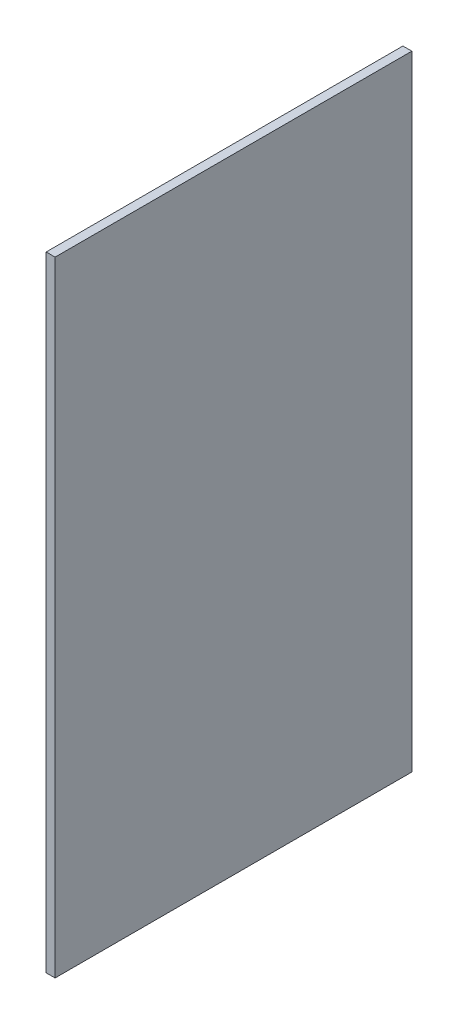
ISO-10303-21;
HEADER;
FILE_DESCRIPTION(('STEP AP214'),'2;1');
FILE_NAME('part.step','',(''),(''),'','','');
FILE_SCHEMA(('AUTOMOTIVE_DESIGN { 1 0 10303 214 1 1 1 1 }'));
ENDSEC;
DATA;
#1=APPLICATION_CONTEXT('core data for automotive mechanical design processes');
#2=APPLICATION_PROTOCOL_DEFINITION('international standard','automotive_design',2000,#1);
#3=PRODUCT_CONTEXT('',#1,'mechanical');
#4=PRODUCT('Part','Part','',(#3));
#5=PRODUCT_RELATED_PRODUCT_CATEGORY('part','',(#4));
#6=PRODUCT_DEFINITION_FORMATION('','',#4);
#7=PRODUCT_DEFINITION_CONTEXT('part definition',#1,'design');
#8=PRODUCT_DEFINITION('design','',#6,#7);
#9=PRODUCT_DEFINITION_SHAPE('','',#8);
#10=(LENGTH_UNIT() NAMED_UNIT(*) SI_UNIT(.MILLI.,.METRE.));
#11=(NAMED_UNIT(*) PLANE_ANGLE_UNIT() SI_UNIT($,.RADIAN.));
#12=(NAMED_UNIT(*) SI_UNIT($,.STERADIAN.) SOLID_ANGLE_UNIT());
#13=UNCERTAINTY_MEASURE_WITH_UNIT(LENGTH_MEASURE(1.E-05),#10,'distance_accuracy_value','');
#14=(GEOMETRIC_REPRESENTATION_CONTEXT(3) GLOBAL_UNCERTAINTY_ASSIGNED_CONTEXT((#13)) GLOBAL_UNIT_ASSIGNED_CONTEXT((#10,
#11,#12)) REPRESENTATION_CONTEXT('',''));
#15=CARTESIAN_POINT('',(0.,0.,0.));
#16=DIRECTION('',(0.,0.,1.));
#17=DIRECTION('',(1.,0.,0.));
#18=AXIS2_PLACEMENT_3D('',#15,#16,#17);
#19=CARTESIAN_POINT('',(1.,-32.1705539085013,36.6871117788508));
#20=DIRECTION('',(0.,0.,1.));
#21=DIRECTION('',(1.,0.,0.));
#22=AXIS2_PLACEMENT_3D('',#19,#20,#21);
#23=PLANE('',#22);
#24=DIRECTION('',(0.,1.,0.));
#25=VECTOR('',#24,1.);
#26=CARTESIAN_POINT('',(0.,-32.1705539085013,36.6871117788508));
#27=LINE('',#26,#25);
#28=CARTESIAN_POINT('',(0.,-32.1705539085013,36.6871117788508));
#29=VERTEX_POINT('',#28);
#30=CARTESIAN_POINT('',(0.,37.8294460914987,36.6871117788508));
#31=VERTEX_POINT('',#30);
#32=EDGE_CURVE('E100',#29,#31,#27,.T.);
#33=ORIENTED_EDGE('',*,*,#32,.T.);
#34=DIRECTION('',(-1.,0.,0.));
#35=VECTOR('',#34,1.);
#36=CARTESIAN_POINT('',(1.,37.8294460914987,36.6871117788508));
#37=LINE('',#36,#35);
#38=CARTESIAN_POINT('',(1.,37.8294460914987,36.6871117788508));
#39=VERTEX_POINT('',#38);
#40=EDGE_CURVE('E11',#39,#31,#37,.T.);
#41=ORIENTED_EDGE('',*,*,#40,.F.);
#42=DIRECTION('',(0.,1.,0.));
#43=VECTOR('',#42,1.);
#44=CARTESIAN_POINT('',(1.,-32.1705539085013,36.6871117788508));
#45=LINE('',#44,#43);
#46=CARTESIAN_POINT('',(1.,-32.1705539085013,36.6871117788508));
#47=VERTEX_POINT('',#46);
#48=EDGE_CURVE('E88',#47,#39,#45,.T.);
#49=ORIENTED_EDGE('',*,*,#48,.F.);
#50=DIRECTION('',(-1.,0.,0.));
#51=VECTOR('',#50,1.);
#52=CARTESIAN_POINT('',(1.,-32.1705539085013,36.6871117788508));
#53=LINE('',#52,#51);
#54=EDGE_CURVE('E96',#47,#29,#53,.T.);
#55=ORIENTED_EDGE('',*,*,#54,.T.);
#56=EDGE_LOOP('',(#33,#41,#49,#55));
#57=FACE_BOUND('',#56,.T.);
#58=ADVANCED_FACE('F37',(#57),#23,.F.);
#59=CARTESIAN_POINT('',(1.,37.8294460914987,36.6871117788508));
#60=DIRECTION('',(0.,-1.,0.));
#61=DIRECTION('',(0.,0.,-1.));
#62=AXIS2_PLACEMENT_3D('',#59,#60,#61);
#63=PLANE('',#62);
#64=DIRECTION('',(0.,0.,1.));
#65=VECTOR('',#64,1.);
#66=CARTESIAN_POINT('',(0.,37.8294460914987,36.6871117788508));
#67=LINE('',#66,#65);
#68=CARTESIAN_POINT('',(0.,37.8294460914987,76.6871117788508));
#69=VERTEX_POINT('',#68);
#70=EDGE_CURVE('E92',#31,#69,#67,.T.);
#71=ORIENTED_EDGE('',*,*,#70,.T.);
#72=DIRECTION('',(-1.,0.,0.));
#73=VECTOR('',#72,1.);
#74=CARTESIAN_POINT('',(1.,37.8294460914987,76.6871117788508));
#75=LINE('',#74,#73);
#76=CARTESIAN_POINT('',(1.,37.8294460914987,76.6871117788508));
#77=VERTEX_POINT('',#76);
#78=EDGE_CURVE('E45',#77,#69,#75,.T.);
#79=ORIENTED_EDGE('',*,*,#78,.F.);
#80=DIRECTION('',(0.,0.,1.));
#81=VECTOR('',#80,1.);
#82=CARTESIAN_POINT('',(1.,37.8294460914987,36.6871117788508));
#83=LINE('',#82,#81);
#84=EDGE_CURVE('E83',#39,#77,#83,.T.);
#85=ORIENTED_EDGE('',*,*,#84,.F.);
#86=ORIENTED_EDGE('',*,*,#40,.T.);
#87=EDGE_LOOP('',(#71,#79,#85,#86));
#88=FACE_BOUND('',#87,.T.);
#89=ADVANCED_FACE('F91',(#88),#63,.F.);
#90=CARTESIAN_POINT('',(1.,-32.1705539085013,76.6871117788508));
#91=DIRECTION('',(0.,0.,-1.));
#92=DIRECTION('',(-1.,0.,0.));
#93=AXIS2_PLACEMENT_3D('',#90,#91,#92);
#94=PLANE('',#93);
#95=DIRECTION('',(0.,-1.,0.));
#96=VECTOR('',#95,1.);
#97=CARTESIAN_POINT('',(0.,-32.1705539085013,76.6871117788508));
#98=LINE('',#97,#96);
#99=CARTESIAN_POINT('',(0.,-32.1705539085013,76.6871117788508));
#100=VERTEX_POINT('',#99);
#101=EDGE_CURVE('E70',#69,#100,#98,.T.);
#102=ORIENTED_EDGE('',*,*,#101,.T.);
#103=DIRECTION('',(-1.,0.,0.));
#104=VECTOR('',#103,1.);
#105=CARTESIAN_POINT('',(1.,-32.1705539085013,76.6871117788508));
#106=LINE('',#105,#104);
#107=CARTESIAN_POINT('',(1.,-32.1705539085013,76.6871117788508));
#108=VERTEX_POINT('',#107);
#109=EDGE_CURVE('E93',#108,#100,#106,.T.);
#110=ORIENTED_EDGE('',*,*,#109,.F.);
#111=DIRECTION('',(0.,-1.,0.));
#112=VECTOR('',#111,1.);
#113=CARTESIAN_POINT('',(1.,-32.1705539085013,76.6871117788508));
#114=LINE('',#113,#112);
#115=EDGE_CURVE('E86',#77,#108,#114,.T.);
#116=ORIENTED_EDGE('',*,*,#115,.F.);
#117=ORIENTED_EDGE('',*,*,#78,.T.);
#118=EDGE_LOOP('',(#102,#110,#116,#117));
#119=FACE_BOUND('',#118,.T.);
#120=ADVANCED_FACE('F94',(#119),#94,.F.);
#121=CARTESIAN_POINT('',(1.,-32.1705539085013,36.6871117788508));
#122=DIRECTION('',(0.,1.,0.));
#123=DIRECTION('',(0.,0.,1.));
#124=AXIS2_PLACEMENT_3D('',#121,#122,#123);
#125=PLANE('',#124);
#126=DIRECTION('',(0.,0.,-1.));
#127=VECTOR('',#126,1.);
#128=CARTESIAN_POINT('',(0.,-32.1705539085013,36.6871117788508));
#129=LINE('',#128,#127);
#130=EDGE_CURVE('E76',#100,#29,#129,.T.);
#131=ORIENTED_EDGE('',*,*,#130,.T.);
#132=ORIENTED_EDGE('',*,*,#54,.F.);
#133=DIRECTION('',(0.,0.,-1.));
#134=VECTOR('',#133,1.);
#135=CARTESIAN_POINT('',(1.,-32.1705539085013,36.6871117788508));
#136=LINE('',#135,#134);
#137=EDGE_CURVE('E53',#108,#47,#136,.T.);
#138=ORIENTED_EDGE('',*,*,#137,.F.);
#139=ORIENTED_EDGE('',*,*,#109,.T.);
#140=EDGE_LOOP('',(#131,#132,#138,#139));
#141=FACE_BOUND('',#140,.T.);
#142=ADVANCED_FACE('F107',(#141),#125,.F.);
#143=CARTESIAN_POINT('',(1.,0.,0.));
#144=DIRECTION('',(1.,0.,0.));
#145=DIRECTION('',(0.,0.,-1.));
#146=AXIS2_PLACEMENT_3D('',#143,#144,#145);
#147=PLANE('',#146);
#148=ORIENTED_EDGE('',*,*,#48,.T.);
#149=ORIENTED_EDGE('',*,*,#84,.T.);
#150=ORIENTED_EDGE('',*,*,#115,.T.);
#151=ORIENTED_EDGE('',*,*,#137,.T.);
#152=EDGE_LOOP('',(#148,#149,#150,#151));
#153=FACE_BOUND('',#152,.T.);
#154=ADVANCED_FACE('F84',(#153),#147,.T.);
#155=CARTESIAN_POINT('',(0.,0.,0.));
#156=DIRECTION('',(1.,0.,0.));
#157=DIRECTION('',(0.,0.,-1.));
#158=AXIS2_PLACEMENT_3D('',#155,#156,#157);
#159=PLANE('',#158);
#160=ORIENTED_EDGE('',*,*,#32,.F.);
#161=ORIENTED_EDGE('',*,*,#130,.F.);
#162=ORIENTED_EDGE('',*,*,#101,.F.);
#163=ORIENTED_EDGE('',*,*,#70,.F.);
#164=EDGE_LOOP('',(#160,#161,#162,#163));
#165=FACE_BOUND('',#164,.T.);
#166=ADVANCED_FACE('F110',(#165),#159,.F.);
#167=CLOSED_SHELL('',(#58,#89,#120,#142,#154,#166));
#168=MANIFOLD_SOLID_BREP('B2',#167);
#169=ADVANCED_BREP_SHAPE_REPRESENTATION('',(#18,#168),#14);
#170=SHAPE_DEFINITION_REPRESENTATION(#9,#169);
ENDSEC;
END-ISO-10303-21;
